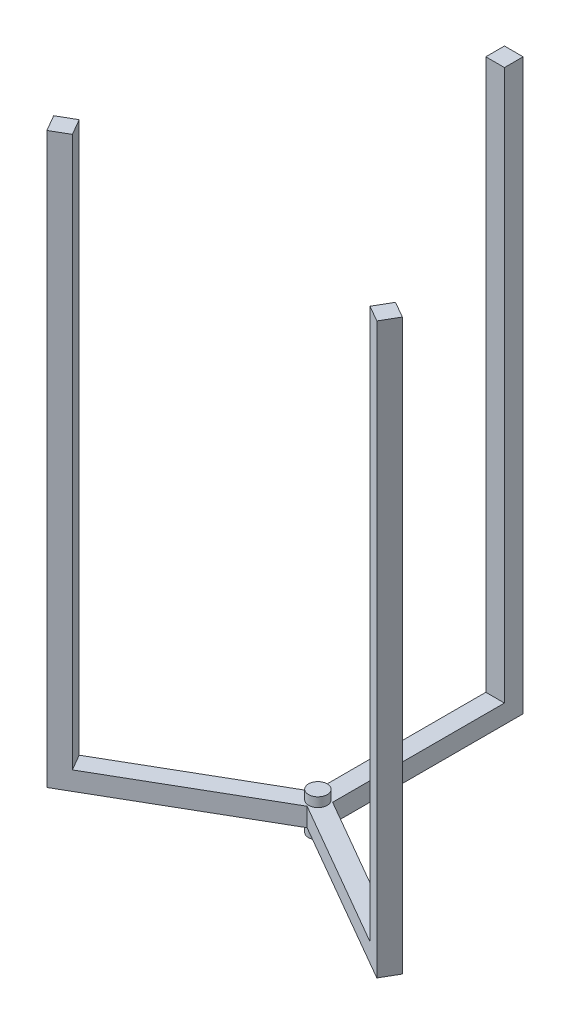
ISO-10303-21;
HEADER;
FILE_DESCRIPTION(('STEP AP214'),'2;1');
FILE_NAME('part.step','',(''),(''),'','','');
FILE_SCHEMA(('AUTOMOTIVE_DESIGN { 1 0 10303 214 1 1 1 1 }'));
ENDSEC;
DATA;
#1=APPLICATION_CONTEXT('core data for automotive mechanical design processes');
#2=APPLICATION_PROTOCOL_DEFINITION('international standard','automotive_design',2000,#1);
#3=PRODUCT_CONTEXT('',#1,'mechanical');
#4=PRODUCT('Part','Part','',(#3));
#5=PRODUCT_RELATED_PRODUCT_CATEGORY('part','',(#4));
#6=PRODUCT_DEFINITION_FORMATION('','',#4);
#7=PRODUCT_DEFINITION_CONTEXT('part definition',#1,'design');
#8=PRODUCT_DEFINITION('design','',#6,#7);
#9=PRODUCT_DEFINITION_SHAPE('','',#8);
#10=(LENGTH_UNIT() NAMED_UNIT(*) SI_UNIT(.MILLI.,.METRE.));
#11=(NAMED_UNIT(*) PLANE_ANGLE_UNIT() SI_UNIT($,.RADIAN.));
#12=(NAMED_UNIT(*) SI_UNIT($,.STERADIAN.) SOLID_ANGLE_UNIT());
#13=UNCERTAINTY_MEASURE_WITH_UNIT(LENGTH_MEASURE(1.E-05),#10,'distance_accuracy_value','');
#14=(GEOMETRIC_REPRESENTATION_CONTEXT(3) GLOBAL_UNCERTAINTY_ASSIGNED_CONTEXT((#13)) GLOBAL_UNIT_ASSIGNED_CONTEXT((#10,
#11,#12)) REPRESENTATION_CONTEXT('',''));
#15=CARTESIAN_POINT('',(0.,0.,0.));
#16=DIRECTION('',(0.,0.,1.));
#17=DIRECTION('',(1.,0.,0.));
#18=AXIS2_PLACEMENT_3D('',#15,#16,#17);
#19=CARTESIAN_POINT('',(0.,2.,0.));
#20=DIRECTION('',(0.,-1.,0.));
#21=DIRECTION('',(0.,0.,-1.));
#22=AXIS2_PLACEMENT_3D('',#19,#20,#21);
#23=CYLINDRICAL_SURFACE('',#22,1.);
#24=CARTESIAN_POINT('',(0.,-2.,0.));
#25=DIRECTION('',(0.,1.,0.));
#26=DIRECTION('',(0.,0.,1.));
#27=AXIS2_PLACEMENT_3D('',#24,#25,#26);
#28=CIRCLE('',#27,1.);
#29=CARTESIAN_POINT('',(0.,-2.,1.));
#30=VERTEX_POINT('',#29);
#31=EDGE_CURVE('E223',#30,#30,#28,.T.);
#32=ORIENTED_EDGE('',*,*,#31,.T.);
#33=EDGE_LOOP('',(#32));
#34=FACE_BOUND('',#33,.T.);
#35=CARTESIAN_POINT('',(0.,-1.,0.));
#36=DIRECTION('',(0.,-1.,0.));
#37=DIRECTION('',(0.,0.,-1.));
#38=AXIS2_PLACEMENT_3D('',#35,#36,#37);
#39=CIRCLE('',#38,1.);
#40=CARTESIAN_POINT('',(0.,-1.,-1.));
#41=VERTEX_POINT('',#40);
#42=EDGE_CURVE('E227',#41,#41,#39,.F.);
#43=ORIENTED_EDGE('',*,*,#42,.F.);
#44=EDGE_LOOP('',(#43));
#45=FACE_BOUND('',#44,.T.);
#46=ADVANCED_FACE('F38',(#34,#45),#23,.T.);
#47=CARTESIAN_POINT('',(-1.,-0.999999999999999,-22.8284271247462));
#48=DIRECTION('',(0.,-1.,0.));
#49=DIRECTION('',(0.,0.,-1.));
#50=AXIS2_PLACEMENT_3D('',#47,#48,#49);
#51=PLANE('',#50);
#52=DIRECTION('',(-0.866025403784436,0.,-0.500000000000004));
#53=VECTOR('',#52,1.);
#54=CARTESIAN_POINT('',(19.2699978184719,-0.999999999999999,12.2802389661576));
#55=LINE('',#54,#53);
#56=CARTESIAN_POINT('',(17.6865334794732,-0.999999999999999,11.3660254037845));
#57=VERTEX_POINT('',#56);
#58=CARTESIAN_POINT('',(0.,-1.,1.15470053837925));
#59=VERTEX_POINT('',#58);
#60=EDGE_CURVE('E172',#57,#59,#55,.T.);
#61=ORIENTED_EDGE('',*,*,#60,.T.);
#62=DIRECTION('',(0.866025403784443,0.,-0.499999999999992));
#63=VECTOR('',#62,1.);
#64=CARTESIAN_POINT('',(-19.2699978184721,-0.999999999999999,12.2802389661574));
#65=LINE('',#64,#63);
#66=CARTESIAN_POINT('',(-17.6865334794733,-0.999999999999999,11.3660254037843));
#67=VERTEX_POINT('',#66);
#68=EDGE_CURVE('E149',#67,#59,#65,.T.);
#69=ORIENTED_EDGE('',*,*,#68,.F.);
#70=DIRECTION('',(-0.499999999999992,0.,-0.866025403784443));
#71=VECTOR('',#70,1.);
#72=CARTESIAN_POINT('',(-17.6865334794733,-0.999999999999999,11.3660254037843));
#73=LINE('',#72,#71);
#74=CARTESIAN_POINT('',(-18.6865334794733,-0.999999999999999,9.63397459621539));
#75=VERTEX_POINT('',#74);
#76=EDGE_CURVE('E158',#67,#75,#73,.T.);
#77=ORIENTED_EDGE('',*,*,#76,.T.);
#78=DIRECTION('',(0.866025403784443,0.,-0.499999999999992));
#79=VECTOR('',#78,1.);
#80=CARTESIAN_POINT('',(-20.269997818472,-0.999999999999999,10.5481881585885));
#81=LINE('',#80,#79);
#82=CARTESIAN_POINT('',(-0.999999999999999,-1.,-0.577350269189647));
#83=VERTEX_POINT('',#82);
#84=EDGE_CURVE('E173',#75,#83,#81,.T.);
#85=ORIENTED_EDGE('',*,*,#84,.T.);
#86=DIRECTION('',(0.,0.,1.));
#87=VECTOR('',#86,1.);
#88=CARTESIAN_POINT('',(-1.,-0.999999999999999,-22.8284271247462));
#89=LINE('',#88,#87);
#90=CARTESIAN_POINT('',(-1.,-0.999999999999999,-21.));
#91=VERTEX_POINT('',#90);
#92=EDGE_CURVE('E53',#91,#83,#89,.T.);
#93=ORIENTED_EDGE('',*,*,#92,.F.);
#94=DIRECTION('',(1.,0.,0.));
#95=VECTOR('',#94,1.);
#96=CARTESIAN_POINT('',(-1.,-0.999999999999999,-21.));
#97=LINE('',#96,#95);
#98=CARTESIAN_POINT('',(0.999999999999999,-0.999999999999999,-21.));
#99=VERTEX_POINT('',#98);
#100=EDGE_CURVE('E240',#91,#99,#97,.T.);
#101=ORIENTED_EDGE('',*,*,#100,.T.);
#102=DIRECTION('',(0.,0.,1.));
#103=VECTOR('',#102,1.);
#104=CARTESIAN_POINT('',(0.999999999999998,-0.999999999999999,-22.8284271247462));
#105=LINE('',#104,#103);
#106=CARTESIAN_POINT('',(0.999999999999998,-1.,-0.577350269189623));
#107=VERTEX_POINT('',#106);
#108=EDGE_CURVE('E252',#99,#107,#105,.T.);
#109=ORIENTED_EDGE('',*,*,#108,.T.);
#110=DIRECTION('',(-0.866025403784436,0.,-0.500000000000004));
#111=VECTOR('',#110,1.);
#112=CARTESIAN_POINT('',(20.2699978184719,-0.999999999999999,10.5481881585887));
#113=LINE('',#112,#111);
#114=CARTESIAN_POINT('',(18.6865334794732,-0.999999999999999,9.63397459621565));
#115=VERTEX_POINT('',#114);
#116=EDGE_CURVE('E188',#115,#107,#113,.T.);
#117=ORIENTED_EDGE('',*,*,#116,.F.);
#118=DIRECTION('',(-0.500000000000004,0.,0.866025403784436));
#119=VECTOR('',#118,1.);
#120=CARTESIAN_POINT('',(18.6865334794732,-0.999999999999999,9.63397459621565));
#121=LINE('',#120,#119);
#122=EDGE_CURVE('E197',#115,#57,#121,.T.);
#123=ORIENTED_EDGE('',*,*,#122,.T.);
#124=EDGE_LOOP('',(#61,#69,#77,#85,#93,#101,#109,#117,#123));
#125=FACE_BOUND('',#124,.T.);
#126=ORIENTED_EDGE('',*,*,#42,.T.);
#127=EDGE_LOOP('',(#126));
#128=FACE_BOUND('',#127,.T.);
#129=ADVANCED_FACE('F168',(#125,#128),#51,.T.);
#130=CARTESIAN_POINT('',(-1.,1.,-22.8284271247462));
#131=DIRECTION('',(0.,1.,0.));
#132=DIRECTION('',(0.,0.,1.));
#133=AXIS2_PLACEMENT_3D('',#130,#131,#132);
#134=PLANE('',#133);
#135=CARTESIAN_POINT('',(0.,1.,0.));
#136=DIRECTION('',(0.,1.,0.));
#137=DIRECTION('',(0.,0.,1.));
#138=AXIS2_PLACEMENT_3D('',#135,#136,#137);
#139=CIRCLE('',#138,1.);
#140=CARTESIAN_POINT('',(0.,1.,1.));
#141=VERTEX_POINT('',#140);
#142=EDGE_CURVE('E46',#141,#141,#139,.F.);
#143=ORIENTED_EDGE('',*,*,#142,.T.);
#144=EDGE_LOOP('',(#143));
#145=FACE_BOUND('',#144,.T.);
#146=DIRECTION('',(0.866025403784443,0.,-0.499999999999992));
#147=VECTOR('',#146,1.);
#148=CARTESIAN_POINT('',(-19.2699978184721,1.,12.2802389661574));
#149=LINE('',#148,#147);
#150=CARTESIAN_POINT('',(-15.9544826719044,1.,10.3660254037843));
#151=VERTEX_POINT('',#150);
#152=CARTESIAN_POINT('',(0.,1.,1.15470053837925));
#153=VERTEX_POINT('',#152);
#154=EDGE_CURVE('E165',#151,#153,#149,.T.);
#155=ORIENTED_EDGE('',*,*,#154,.T.);
#156=DIRECTION('',(-0.866025403784436,0.,-0.500000000000004));
#157=VECTOR('',#156,1.);
#158=CARTESIAN_POINT('',(19.2699978184719,1.,12.2802389661576));
#159=LINE('',#158,#157);
#160=CARTESIAN_POINT('',(15.9544826719043,1.,10.3660254037845));
#161=VERTEX_POINT('',#160);
#162=EDGE_CURVE('E206',#161,#153,#159,.T.);
#163=ORIENTED_EDGE('',*,*,#162,.F.);
#164=DIRECTION('',(0.500000000000004,0.,-0.866025403784436));
#165=VECTOR('',#164,1.);
#166=CARTESIAN_POINT('',(16.9544826719043,1.,8.63397459621564));
#167=LINE('',#166,#165);
#168=CARTESIAN_POINT('',(16.9544826719043,1.,8.63397459621564));
#169=VERTEX_POINT('',#168);
#170=EDGE_CURVE('E199',#161,#169,#167,.T.);
#171=ORIENTED_EDGE('',*,*,#170,.T.);
#172=DIRECTION('',(-0.866025403784436,0.,-0.500000000000004));
#173=VECTOR('',#172,1.);
#174=CARTESIAN_POINT('',(20.2699978184719,1.,10.5481881585887));
#175=LINE('',#174,#173);
#176=CARTESIAN_POINT('',(0.999999999999999,1.,-0.577350269189623));
#177=VERTEX_POINT('',#176);
#178=EDGE_CURVE('E200',#169,#177,#175,.T.);
#179=ORIENTED_EDGE('',*,*,#178,.T.);
#180=DIRECTION('',(0.,0.,1.));
#181=VECTOR('',#180,1.);
#182=CARTESIAN_POINT('',(0.999999999999999,1.,-22.8284271247462));
#183=LINE('',#182,#181);
#184=CARTESIAN_POINT('',(0.999999999999999,1.,-19.));
#185=VERTEX_POINT('',#184);
#186=EDGE_CURVE('E249',#185,#177,#183,.T.);
#187=ORIENTED_EDGE('',*,*,#186,.F.);
#188=DIRECTION('',(-1.,0.,0.));
#189=VECTOR('',#188,1.);
#190=CARTESIAN_POINT('',(-1.,1.,-19.));
#191=LINE('',#190,#189);
#192=CARTESIAN_POINT('',(-1.,1.,-19.));
#193=VERTEX_POINT('',#192);
#194=EDGE_CURVE('E243',#185,#193,#191,.T.);
#195=ORIENTED_EDGE('',*,*,#194,.T.);
#196=DIRECTION('',(0.,0.,1.));
#197=VECTOR('',#196,1.);
#198=CARTESIAN_POINT('',(-1.,1.,-22.8284271247462));
#199=LINE('',#198,#197);
#200=CARTESIAN_POINT('',(-0.999999999999999,1.,-0.57735026918963));
#201=VERTEX_POINT('',#200);
#202=EDGE_CURVE('E244',#193,#201,#199,.T.);
#203=ORIENTED_EDGE('',*,*,#202,.T.);
#204=DIRECTION('',(0.866025403784443,0.,-0.499999999999992));
#205=VECTOR('',#204,1.);
#206=CARTESIAN_POINT('',(-20.269997818472,1.,10.5481881585885));
#207=LINE('',#206,#205);
#208=CARTESIAN_POINT('',(-16.9544826719044,1.,8.6339745962154));
#209=VERTEX_POINT('',#208);
#210=EDGE_CURVE('E175',#209,#201,#207,.T.);
#211=ORIENTED_EDGE('',*,*,#210,.F.);
#212=DIRECTION('',(0.499999999999992,0.,0.866025403784443));
#213=VECTOR('',#212,1.);
#214=CARTESIAN_POINT('',(-15.9544826719044,1.,10.3660254037843));
#215=LINE('',#214,#213);
#216=EDGE_CURVE('E164',#209,#151,#215,.T.);
#217=ORIENTED_EDGE('',*,*,#216,.T.);
#218=EDGE_LOOP('',(#155,#163,#171,#179,#187,#195,#203,#211,#217));
#219=FACE_BOUND('',#218,.T.);
#220=ADVANCED_FACE('F269',(#145,#219),#134,.T.);
#221=CARTESIAN_POINT('',(-1.,1.,-19.));
#222=DIRECTION('',(0.,0.,-1.));
#223=DIRECTION('',(-1.,0.,0.));
#224=AXIS2_PLACEMENT_3D('',#221,#222,#223);
#225=PLANE('',#224);
#226=DIRECTION('',(1.,0.,0.));
#227=VECTOR('',#226,1.);
#228=CARTESIAN_POINT('',(-1.,60.,-19.));
#229=LINE('',#228,#227);
#230=CARTESIAN_POINT('',(-1.,60.,-19.));
#231=VERTEX_POINT('',#230);
#232=CARTESIAN_POINT('',(0.999999999999999,60.,-19.));
#233=VERTEX_POINT('',#232);
#234=EDGE_CURVE('E234',#231,#233,#229,.T.);
#235=ORIENTED_EDGE('',*,*,#234,.F.);
#236=DIRECTION('',(0.,1.,0.));
#237=VECTOR('',#236,1.);
#238=CARTESIAN_POINT('',(-1.,1.,-19.));
#239=LINE('',#238,#237);
#240=EDGE_CURVE('E258',#193,#231,#239,.T.);
#241=ORIENTED_EDGE('',*,*,#240,.F.);
#242=ORIENTED_EDGE('',*,*,#194,.F.);
#243=DIRECTION('',(0.,1.,0.));
#244=VECTOR('',#243,1.);
#245=CARTESIAN_POINT('',(0.999999999999999,1.,-19.));
#246=LINE('',#245,#244);
#247=EDGE_CURVE('E247',#185,#233,#246,.T.);
#248=ORIENTED_EDGE('',*,*,#247,.T.);
#249=EDGE_LOOP('',(#235,#241,#242,#248));
#250=FACE_BOUND('',#249,.T.);
#251=ADVANCED_FACE('F304',(#250),#225,.F.);
#252=CARTESIAN_POINT('',(-1.,-0.999999999999999,-21.));
#253=DIRECTION('',(0.,0.,1.));
#254=DIRECTION('',(1.,0.,0.));
#255=AXIS2_PLACEMENT_3D('',#252,#253,#254);
#256=PLANE('',#255);
#257=DIRECTION('',(-1.,0.,0.));
#258=VECTOR('',#257,1.);
#259=CARTESIAN_POINT('',(-1.,60.,-21.));
#260=LINE('',#259,#258);
#261=CARTESIAN_POINT('',(0.999999999999999,60.,-21.));
#262=VERTEX_POINT('',#261);
#263=CARTESIAN_POINT('',(-1.,60.,-21.));
#264=VERTEX_POINT('',#263);
#265=EDGE_CURVE('E239',#262,#264,#260,.T.);
#266=ORIENTED_EDGE('',*,*,#265,.F.);
#267=DIRECTION('',(0.,1.,0.));
#268=VECTOR('',#267,1.);
#269=CARTESIAN_POINT('',(0.999999999999999,-0.999999999999999,-21.));
#270=LINE('',#269,#268);
#271=EDGE_CURVE('E235',#99,#262,#270,.T.);
#272=ORIENTED_EDGE('',*,*,#271,.F.);
#273=ORIENTED_EDGE('',*,*,#100,.F.);
#274=DIRECTION('',(0.,1.,0.));
#275=VECTOR('',#274,1.);
#276=CARTESIAN_POINT('',(-1.,-0.999999999999999,-21.));
#277=LINE('',#276,#275);
#278=EDGE_CURVE('E261',#91,#264,#277,.T.);
#279=ORIENTED_EDGE('',*,*,#278,.T.);
#280=EDGE_LOOP('',(#266,#272,#273,#279));
#281=FACE_BOUND('',#280,.T.);
#282=ADVANCED_FACE('F40',(#281),#256,.F.);
#283=CARTESIAN_POINT('',(-1.,1.,-22.8284271247462));
#284=DIRECTION('',(-1.,0.,0.));
#285=DIRECTION('',(0.,0.,1.));
#286=AXIS2_PLACEMENT_3D('',#283,#284,#285);
#287=PLANE('',#286);
#288=DIRECTION('',(0.,-1.,0.));
#289=VECTOR('',#288,1.);
#290=CARTESIAN_POINT('',(-0.999999999999999,1.00000000000001,-0.577350269189633));
#291=LINE('',#290,#289);
#292=EDGE_CURVE('E57',#201,#83,#291,.T.);
#293=ORIENTED_EDGE('',*,*,#292,.F.);
#294=ORIENTED_EDGE('',*,*,#202,.F.);
#295=ORIENTED_EDGE('',*,*,#240,.T.);
#296=DIRECTION('',(0.,0.,1.));
#297=VECTOR('',#296,1.);
#298=CARTESIAN_POINT('',(-1.,60.,-20.9142135623731));
#299=LINE('',#298,#297);
#300=EDGE_CURVE('E232',#264,#231,#299,.T.);
#301=ORIENTED_EDGE('',*,*,#300,.F.);
#302=ORIENTED_EDGE('',*,*,#278,.F.);
#303=ORIENTED_EDGE('',*,*,#92,.T.);
#304=EDGE_LOOP('',(#293,#294,#295,#301,#302,#303));
#305=FACE_BOUND('',#304,.T.);
#306=ADVANCED_FACE('F306',(#305),#287,.T.);
#307=CARTESIAN_POINT('',(0.999999999999999,1.,-22.8284271247462));
#308=DIRECTION('',(1.,0.,0.));
#309=DIRECTION('',(0.,1.,0.));
#310=AXIS2_PLACEMENT_3D('',#307,#308,#309);
#311=PLANE('',#310);
#312=DIRECTION('',(0.,1.,0.));
#313=VECTOR('',#312,1.);
#314=CARTESIAN_POINT('',(1.,0.999999999999996,-0.577350269189623));
#315=LINE('',#314,#313);
#316=EDGE_CURVE('E221',#107,#177,#315,.T.);
#317=ORIENTED_EDGE('',*,*,#316,.F.);
#318=ORIENTED_EDGE('',*,*,#108,.F.);
#319=ORIENTED_EDGE('',*,*,#271,.T.);
#320=DIRECTION('',(0.,0.,-1.));
#321=VECTOR('',#320,1.);
#322=CARTESIAN_POINT('',(0.999999999999998,60.,-20.9142135623731));
#323=LINE('',#322,#321);
#324=EDGE_CURVE('E237',#233,#262,#323,.T.);
#325=ORIENTED_EDGE('',*,*,#324,.F.);
#326=ORIENTED_EDGE('',*,*,#247,.F.);
#327=ORIENTED_EDGE('',*,*,#186,.T.);
#328=EDGE_LOOP('',(#317,#318,#319,#325,#326,#327));
#329=FACE_BOUND('',#328,.T.);
#330=ADVANCED_FACE('F300',(#329),#311,.T.);
#331=CARTESIAN_POINT('',(0.,60.,-20.));
#332=DIRECTION('',(0.,1.,0.));
#333=DIRECTION('',(0.,0.,1.));
#334=AXIS2_PLACEMENT_3D('',#331,#332,#333);
#335=PLANE('',#334);
#336=ORIENTED_EDGE('',*,*,#324,.T.);
#337=ORIENTED_EDGE('',*,*,#265,.T.);
#338=ORIENTED_EDGE('',*,*,#300,.T.);
#339=ORIENTED_EDGE('',*,*,#234,.T.);
#340=EDGE_LOOP('',(#336,#337,#338,#339));
#341=FACE_BOUND('',#340,.T.);
#342=ADVANCED_FACE('F276',(#341),#335,.T.);
#343=ORIENTED_EDGE('',*,*,#142,.F.);
#344=EDGE_LOOP('',(#343));
#345=FACE_BOUND('',#344,.T.);
#346=CARTESIAN_POINT('',(0.,2.,0.));
#347=DIRECTION('',(0.,1.,0.));
#348=DIRECTION('',(0.,0.,1.));
#349=AXIS2_PLACEMENT_3D('',#346,#347,#348);
#350=CIRCLE('',#349,1.);
#351=CARTESIAN_POINT('',(0.,2.,1.));
#352=VERTEX_POINT('',#351);
#353=EDGE_CURVE('E224',#352,#352,#350,.T.);
#354=ORIENTED_EDGE('',*,*,#353,.F.);
#355=EDGE_LOOP('',(#354));
#356=FACE_BOUND('',#355,.T.);
#357=ADVANCED_FACE('F272',(#345,#356),#23,.T.);
#358=CARTESIAN_POINT('',(0.,2.,0.));
#359=DIRECTION('',(0.,1.,0.));
#360=DIRECTION('',(0.,0.,1.));
#361=AXIS2_PLACEMENT_3D('',#358,#359,#360);
#362=PLANE('',#361);
#363=ORIENTED_EDGE('',*,*,#353,.T.);
#364=EDGE_LOOP('',(#363));
#365=FACE_BOUND('',#364,.T.);
#366=ADVANCED_FACE('F275',(#365),#362,.T.);
#367=CARTESIAN_POINT('',(0.,-2.,0.));
#368=DIRECTION('',(0.,1.,0.));
#369=DIRECTION('',(0.,0.,1.));
#370=AXIS2_PLACEMENT_3D('',#367,#368,#369);
#371=PLANE('',#370);
#372=ORIENTED_EDGE('',*,*,#31,.F.);
#373=EDGE_LOOP('',(#372));
#374=FACE_BOUND('',#373,.T.);
#375=ADVANCED_FACE('F281',(#374),#371,.F.);
#376=CARTESIAN_POINT('',(16.9544826719043,1.,8.63397459621564));
#377=DIRECTION('',(0.866025403784436,0.,0.500000000000004));
#378=DIRECTION('',(0.500000000000004,0.,-0.866025403784436));
#379=AXIS2_PLACEMENT_3D('',#376,#377,#378);
#380=PLANE('',#379);
#381=DIRECTION('',(-0.500000000000004,0.,0.866025403784436));
#382=VECTOR('',#381,1.);
#383=CARTESIAN_POINT('',(16.9544826719043,60.,8.63397459621564));
#384=LINE('',#383,#382);
#385=CARTESIAN_POINT('',(16.9544826719043,60.,8.63397459621564));
#386=VERTEX_POINT('',#385);
#387=CARTESIAN_POINT('',(15.9544826719043,60.,10.3660254037845));
#388=VERTEX_POINT('',#387);
#389=EDGE_CURVE('E191',#386,#388,#384,.T.);
#390=ORIENTED_EDGE('',*,*,#389,.F.);
#391=DIRECTION('',(0.,1.,0.));
#392=VECTOR('',#391,1.);
#393=CARTESIAN_POINT('',(16.9544826719043,1.,8.63397459621564));
#394=LINE('',#393,#392);
#395=EDGE_CURVE('E212',#169,#386,#394,.T.);
#396=ORIENTED_EDGE('',*,*,#395,.F.);
#397=ORIENTED_EDGE('',*,*,#170,.F.);
#398=DIRECTION('',(0.,1.,0.));
#399=VECTOR('',#398,1.);
#400=CARTESIAN_POINT('',(15.9544826719043,1.,10.3660254037845));
#401=LINE('',#400,#399);
#402=EDGE_CURVE('E203',#161,#388,#401,.T.);
#403=ORIENTED_EDGE('',*,*,#402,.T.);
#404=EDGE_LOOP('',(#390,#396,#397,#403));
#405=FACE_BOUND('',#404,.T.);
#406=ADVANCED_FACE('F286',(#405),#380,.F.);
#407=CARTESIAN_POINT('',(18.6865334794732,-0.999999999999999,9.63397459621565));
#408=DIRECTION('',(-0.866025403784436,0.,-0.500000000000004));
#409=DIRECTION('',(-0.500000000000004,0.,0.866025403784436));
#410=AXIS2_PLACEMENT_3D('',#407,#408,#409);
#411=PLANE('',#410);
#412=DIRECTION('',(0.500000000000004,0.,-0.866025403784436));
#413=VECTOR('',#412,1.);
#414=CARTESIAN_POINT('',(18.6865334794732,60.,9.63397459621565));
#415=LINE('',#414,#413);
#416=CARTESIAN_POINT('',(17.6865334794732,60.,11.3660254037845));
#417=VERTEX_POINT('',#416);
#418=CARTESIAN_POINT('',(18.6865334794732,60.,9.63397459621565));
#419=VERTEX_POINT('',#418);
#420=EDGE_CURVE('E196',#417,#419,#415,.T.);
#421=ORIENTED_EDGE('',*,*,#420,.F.);
#422=DIRECTION('',(0.,1.,0.));
#423=VECTOR('',#422,1.);
#424=CARTESIAN_POINT('',(17.6865334794732,-0.999999999999999,11.3660254037845));
#425=LINE('',#424,#423);
#426=EDGE_CURVE('E192',#57,#417,#425,.T.);
#427=ORIENTED_EDGE('',*,*,#426,.F.);
#428=ORIENTED_EDGE('',*,*,#122,.F.);
#429=DIRECTION('',(0.,1.,0.));
#430=VECTOR('',#429,1.);
#431=CARTESIAN_POINT('',(18.6865334794732,-0.999999999999999,9.63397459621565));
#432=LINE('',#431,#430);
#433=EDGE_CURVE('E215',#115,#419,#432,.T.);
#434=ORIENTED_EDGE('',*,*,#433,.T.);
#435=EDGE_LOOP('',(#421,#427,#428,#434));
#436=FACE_BOUND('',#435,.T.);
#437=ADVANCED_FACE('F360',(#436),#411,.F.);
#438=CARTESIAN_POINT('',(20.2699978184719,1.,10.5481881585887));
#439=DIRECTION('',(0.500000000000004,0.,-0.866025403784436));
#440=DIRECTION('',(-0.866025403784437,0.,-0.500000000000004));
#441=AXIS2_PLACEMENT_3D('',#438,#439,#440);
#442=PLANE('',#441);
#443=ORIENTED_EDGE('',*,*,#116,.T.);
#444=ORIENTED_EDGE('',*,*,#316,.T.);
#445=ORIENTED_EDGE('',*,*,#178,.F.);
#446=ORIENTED_EDGE('',*,*,#395,.T.);
#447=DIRECTION('',(-0.866025403784437,0.,-0.500000000000004));
#448=VECTOR('',#447,1.);
#449=CARTESIAN_POINT('',(18.6122402451881,60.,9.59108137740219));
#450=LINE('',#449,#448);
#451=EDGE_CURVE('E189',#419,#386,#450,.T.);
#452=ORIENTED_EDGE('',*,*,#451,.F.);
#453=ORIENTED_EDGE('',*,*,#433,.F.);
#454=EDGE_LOOP('',(#443,#444,#445,#446,#452,#453));
#455=FACE_BOUND('',#454,.T.);
#456=ADVANCED_FACE('F351',(#455),#442,.T.);
#457=CARTESIAN_POINT('',(19.2699978184719,1.,12.2802389661576));
#458=DIRECTION('',(-0.500000000000004,0.,0.866025403784436));
#459=DIRECTION('',(0.866025403784437,0.,0.500000000000004));
#460=AXIS2_PLACEMENT_3D('',#457,#458,#459);
#461=PLANE('',#460);
#462=DIRECTION('',(0.,1.,0.));
#463=VECTOR('',#462,1.);
#464=CARTESIAN_POINT('',(0.,0.999999999999996,1.15470053837925));
#465=LINE('',#464,#463);
#466=EDGE_CURVE('E12',#59,#153,#465,.T.);
#467=ORIENTED_EDGE('',*,*,#466,.F.);
#468=ORIENTED_EDGE('',*,*,#60,.F.);
#469=ORIENTED_EDGE('',*,*,#426,.T.);
#470=DIRECTION('',(0.866025403784437,0.,0.500000000000003));
#471=VECTOR('',#470,1.);
#472=CARTESIAN_POINT('',(17.6122402451881,60.,11.3231321849711));
#473=LINE('',#472,#471);
#474=EDGE_CURVE('E194',#388,#417,#473,.T.);
#475=ORIENTED_EDGE('',*,*,#474,.F.);
#476=ORIENTED_EDGE('',*,*,#402,.F.);
#477=ORIENTED_EDGE('',*,*,#162,.T.);
#478=EDGE_LOOP('',(#467,#468,#469,#475,#476,#477));
#479=FACE_BOUND('',#478,.T.);
#480=ADVANCED_FACE('F345',(#479),#461,.T.);
#481=CARTESIAN_POINT('',(17.3205080756887,60.,10.0000000000001));
#482=DIRECTION('',(0.,1.,0.));
#483=DIRECTION('',(0.,0.,1.));
#484=AXIS2_PLACEMENT_3D('',#481,#482,#483);
#485=PLANE('',#484);
#486=ORIENTED_EDGE('',*,*,#474,.T.);
#487=ORIENTED_EDGE('',*,*,#420,.T.);
#488=ORIENTED_EDGE('',*,*,#451,.T.);
#489=ORIENTED_EDGE('',*,*,#389,.T.);
#490=EDGE_LOOP('',(#486,#487,#488,#489));
#491=FACE_BOUND('',#490,.T.);
#492=ADVANCED_FACE('F362',(#491),#485,.T.);
#493=CARTESIAN_POINT('',(-15.9544826719044,1.,10.3660254037843));
#494=DIRECTION('',(-0.866025403784443,0.,0.499999999999992));
#495=DIRECTION('',(0.499999999999992,0.,0.866025403784443));
#496=AXIS2_PLACEMENT_3D('',#493,#494,#495);
#497=PLANE('',#496);
#498=DIRECTION('',(-0.499999999999992,0.,-0.866025403784443));
#499=VECTOR('',#498,1.);
#500=CARTESIAN_POINT('',(-15.9544826719044,60.,10.3660254037843));
#501=LINE('',#500,#499);
#502=CARTESIAN_POINT('',(-15.9544826719044,60.,10.3660254037843));
#503=VERTEX_POINT('',#502);
#504=CARTESIAN_POINT('',(-16.9544826719044,60.,8.6339745962154));
#505=VERTEX_POINT('',#504);
#506=EDGE_CURVE('E333',#503,#505,#501,.T.);
#507=ORIENTED_EDGE('',*,*,#506,.F.);
#508=DIRECTION('',(0.,1.,0.));
#509=VECTOR('',#508,1.);
#510=CARTESIAN_POINT('',(-15.9544826719044,1.,10.3660254037843));
#511=LINE('',#510,#509);
#512=EDGE_CURVE('E155',#151,#503,#511,.T.);
#513=ORIENTED_EDGE('',*,*,#512,.F.);
#514=ORIENTED_EDGE('',*,*,#216,.F.);
#515=DIRECTION('',(0.,1.,0.));
#516=VECTOR('',#515,1.);
#517=CARTESIAN_POINT('',(-16.9544826719044,1.,8.6339745962154));
#518=LINE('',#517,#516);
#519=EDGE_CURVE('E179',#209,#505,#518,.T.);
#520=ORIENTED_EDGE('',*,*,#519,.T.);
#521=EDGE_LOOP('',(#507,#513,#514,#520));
#522=FACE_BOUND('',#521,.T.);
#523=ADVANCED_FACE('F339',(#522),#497,.F.);
#524=CARTESIAN_POINT('',(-17.6865334794733,-0.999999999999999,11.3660254037843));
#525=DIRECTION('',(0.866025403784443,0.,-0.499999999999992));
#526=DIRECTION('',(-0.499999999999992,0.,-0.866025403784443));
#527=AXIS2_PLACEMENT_3D('',#524,#525,#526);
#528=PLANE('',#527);
#529=DIRECTION('',(0.499999999999992,0.,0.866025403784443));
#530=VECTOR('',#529,1.);
#531=CARTESIAN_POINT('',(-17.6865334794733,60.,11.3660254037843));
#532=LINE('',#531,#530);
#533=CARTESIAN_POINT('',(-18.6865334794733,60.,9.63397459621539));
#534=VERTEX_POINT('',#533);
#535=CARTESIAN_POINT('',(-17.6865334794733,60.,11.3660254037843));
#536=VERTEX_POINT('',#535);
#537=EDGE_CURVE('E184',#534,#536,#532,.T.);
#538=ORIENTED_EDGE('',*,*,#537,.F.);
#539=DIRECTION('',(0.,1.,0.));
#540=VECTOR('',#539,1.);
#541=CARTESIAN_POINT('',(-18.6865334794733,-0.999999999999999,9.63397459621539));
#542=LINE('',#541,#540);
#543=EDGE_CURVE('E154',#75,#534,#542,.T.);
#544=ORIENTED_EDGE('',*,*,#543,.F.);
#545=ORIENTED_EDGE('',*,*,#76,.F.);
#546=DIRECTION('',(0.,1.,0.));
#547=VECTOR('',#546,1.);
#548=CARTESIAN_POINT('',(-17.6865334794733,-0.999999999999999,11.3660254037843));
#549=LINE('',#548,#547);
#550=EDGE_CURVE('E145',#67,#536,#549,.T.);
#551=ORIENTED_EDGE('',*,*,#550,.T.);
#552=EDGE_LOOP('',(#538,#544,#545,#551));
#553=FACE_BOUND('',#552,.T.);
#554=ADVANCED_FACE('F159',(#553),#528,.F.);
#555=CARTESIAN_POINT('',(-19.2699978184721,1.,12.2802389661574));
#556=DIRECTION('',(0.499999999999992,0.,0.866025403784443));
#557=DIRECTION('',(0.866025403784443,0.,-0.499999999999992));
#558=AXIS2_PLACEMENT_3D('',#555,#556,#557);
#559=PLANE('',#558);
#560=ORIENTED_EDGE('',*,*,#68,.T.);
#561=ORIENTED_EDGE('',*,*,#466,.T.);
#562=ORIENTED_EDGE('',*,*,#154,.F.);
#563=ORIENTED_EDGE('',*,*,#512,.T.);
#564=DIRECTION('',(0.866025403784443,0.,-0.499999999999992));
#565=VECTOR('',#564,1.);
#566=CARTESIAN_POINT('',(-17.6122402451883,60.,11.3231321849708));
#567=LINE('',#566,#565);
#568=EDGE_CURVE('E151',#536,#503,#567,.T.);
#569=ORIENTED_EDGE('',*,*,#568,.F.);
#570=ORIENTED_EDGE('',*,*,#550,.F.);
#571=EDGE_LOOP('',(#560,#561,#562,#563,#569,#570));
#572=FACE_BOUND('',#571,.T.);
#573=ADVANCED_FACE('F147',(#572),#559,.T.);
#574=CARTESIAN_POINT('',(-20.269997818472,1.,10.5481881585885));
#575=DIRECTION('',(-0.499999999999992,0.,-0.866025403784443));
#576=DIRECTION('',(-0.866025403784443,0.,0.499999999999992));
#577=AXIS2_PLACEMENT_3D('',#574,#575,#576);
#578=PLANE('',#577);
#579=ORIENTED_EDGE('',*,*,#210,.T.);
#580=ORIENTED_EDGE('',*,*,#292,.T.);
#581=ORIENTED_EDGE('',*,*,#84,.F.);
#582=ORIENTED_EDGE('',*,*,#543,.T.);
#583=DIRECTION('',(-0.866025403784443,0.,0.499999999999992));
#584=VECTOR('',#583,1.);
#585=CARTESIAN_POINT('',(-18.6122402451882,60.,9.59108137740194));
#586=LINE('',#585,#584);
#587=EDGE_CURVE('E186',#505,#534,#586,.T.);
#588=ORIENTED_EDGE('',*,*,#587,.F.);
#589=ORIENTED_EDGE('',*,*,#519,.F.);
#590=EDGE_LOOP('',(#579,#580,#581,#582,#588,#589));
#591=FACE_BOUND('',#590,.T.);
#592=ADVANCED_FACE('F326',(#591),#578,.T.);
#593=CARTESIAN_POINT('',(-17.3205080756889,60.,9.99999999999984));
#594=DIRECTION('',(0.,1.,0.));
#595=DIRECTION('',(0.,0.,1.));
#596=AXIS2_PLACEMENT_3D('',#593,#594,#595);
#597=PLANE('',#596);
#598=ORIENTED_EDGE('',*,*,#587,.T.);
#599=ORIENTED_EDGE('',*,*,#537,.T.);
#600=ORIENTED_EDGE('',*,*,#568,.T.);
#601=ORIENTED_EDGE('',*,*,#506,.T.);
#602=EDGE_LOOP('',(#598,#599,#600,#601));
#603=FACE_BOUND('',#602,.T.);
#604=ADVANCED_FACE('F337',(#603),#597,.T.);
#605=CLOSED_SHELL('',(#46,#129,#220,#251,#282,#306,#330,#342,#357,#366,#375,#406,#437,#456,#480,
#492,#523,#554,#573,#592,#604));
#606=MANIFOLD_SOLID_BREP('B2',#605);
#607=ADVANCED_BREP_SHAPE_REPRESENTATION('',(#18,#606),#14);
#608=SHAPE_DEFINITION_REPRESENTATION(#9,#607);
ENDSEC;
END-ISO-10303-21;
